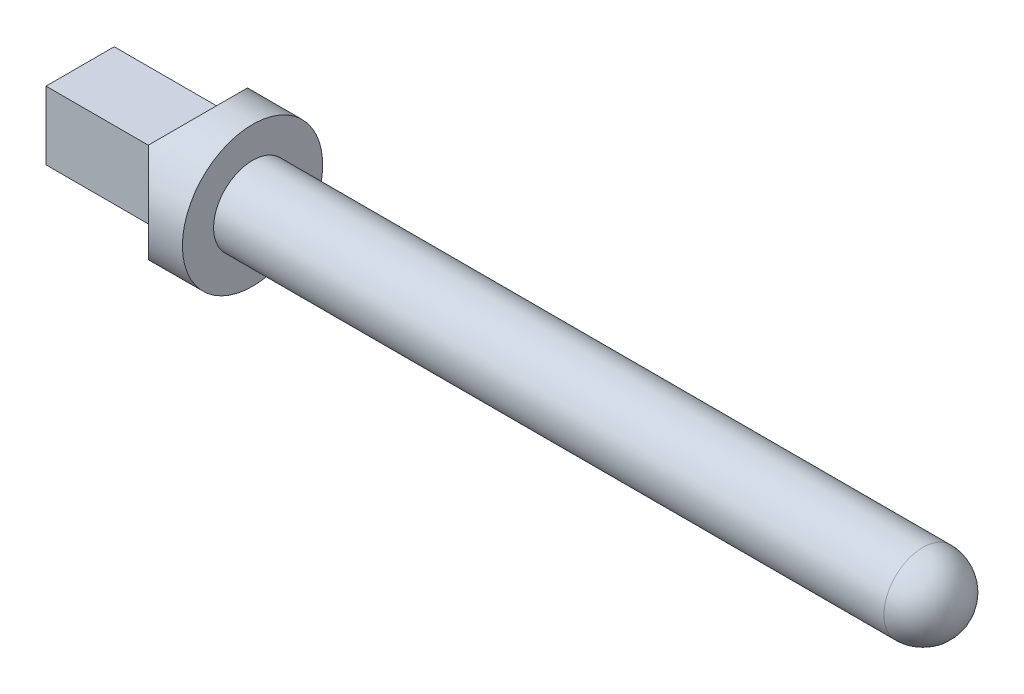
ISO-10303-21;
HEADER;
FILE_DESCRIPTION(('STEP AP214'),'2;1');
FILE_NAME('part.step','',(''),(''),'','','');
FILE_SCHEMA(('AUTOMOTIVE_DESIGN { 1 0 10303 214 1 1 1 1 }'));
ENDSEC;
DATA;
#1=APPLICATION_CONTEXT('core data for automotive mechanical design processes');
#2=APPLICATION_PROTOCOL_DEFINITION('international standard','automotive_design',2000,#1);
#3=PRODUCT_CONTEXT('',#1,'mechanical');
#4=PRODUCT('Part','Part','',(#3));
#5=PRODUCT_RELATED_PRODUCT_CATEGORY('part','',(#4));
#6=PRODUCT_DEFINITION_FORMATION('','',#4);
#7=PRODUCT_DEFINITION_CONTEXT('part definition',#1,'design');
#8=PRODUCT_DEFINITION('design','',#6,#7);
#9=PRODUCT_DEFINITION_SHAPE('','',#8);
#10=(LENGTH_UNIT() NAMED_UNIT(*) SI_UNIT(.MILLI.,.METRE.));
#11=(NAMED_UNIT(*) PLANE_ANGLE_UNIT() SI_UNIT($,.RADIAN.));
#12=(NAMED_UNIT(*) SI_UNIT($,.STERADIAN.) SOLID_ANGLE_UNIT());
#13=UNCERTAINTY_MEASURE_WITH_UNIT(LENGTH_MEASURE(1.E-05),#10,'distance_accuracy_value','');
#14=(GEOMETRIC_REPRESENTATION_CONTEXT(3) GLOBAL_UNCERTAINTY_ASSIGNED_CONTEXT((#13)) GLOBAL_UNIT_ASSIGNED_CONTEXT((#10,
#11,#12)) REPRESENTATION_CONTEXT('',''));
#15=CARTESIAN_POINT('',(0.,0.,0.));
#16=DIRECTION('',(0.,0.,1.));
#17=DIRECTION('',(1.,0.,0.));
#18=AXIS2_PLACEMENT_3D('',#15,#16,#17);
#19=CARTESIAN_POINT('',(-1.524,0.4445,-0.4445));
#20=DIRECTION('',(-1.,0.,0.));
#21=DIRECTION('',(0.,0.,1.));
#22=AXIS2_PLACEMENT_3D('',#19,#20,#21);
#23=PLANE('',#22);
#24=DIRECTION('',(0.,0.,1.));
#25=VECTOR('',#24,1.);
#26=CARTESIAN_POINT('',(-1.524,-0.254,-0.4445));
#27=LINE('',#26,#25);
#28=CARTESIAN_POINT('',(-1.524,-0.254,0.254000000000001));
#29=VERTEX_POINT('',#28);
#30=CARTESIAN_POINT('',(-1.524,-0.254,-0.254));
#31=VERTEX_POINT('',#30);
#32=EDGE_CURVE('E205',#29,#31,#27,.F.);
#33=ORIENTED_EDGE('',*,*,#32,.F.);
#34=DIRECTION('',(0.,1.,0.));
#35=VECTOR('',#34,1.);
#36=CARTESIAN_POINT('',(-1.524,0.4445,0.254));
#37=LINE('',#36,#35);
#38=CARTESIAN_POINT('',(-1.524,0.254,0.254));
#39=VERTEX_POINT('',#38);
#40=EDGE_CURVE('E179',#39,#29,#37,.F.);
#41=ORIENTED_EDGE('',*,*,#40,.F.);
#42=DIRECTION('',(0.,0.,1.));
#43=VECTOR('',#42,1.);
#44=CARTESIAN_POINT('',(-1.524,0.254,-0.4445));
#45=LINE('',#44,#43);
#46=CARTESIAN_POINT('',(-1.524,0.254,-0.254));
#47=VERTEX_POINT('',#46);
#48=EDGE_CURVE('E185',#47,#39,#45,.T.);
#49=ORIENTED_EDGE('',*,*,#48,.F.);
#50=DIRECTION('',(0.,1.,0.));
#51=VECTOR('',#50,1.);
#52=CARTESIAN_POINT('',(-1.524,0.4445,-0.254));
#53=LINE('',#52,#51);
#54=EDGE_CURVE('E199',#31,#47,#53,.T.);
#55=ORIENTED_EDGE('',*,*,#54,.F.);
#56=EDGE_LOOP('',(#33,#41,#49,#55));
#57=FACE_BOUND('',#56,.T.);
#58=ADVANCED_FACE('F17',(#57),#23,.T.);
#59=CARTESIAN_POINT('',(-1.524,-0.254,-0.4445));
#60=DIRECTION('',(-0.707106781186548,-0.707106781186548,0.));
#61=DIRECTION('',(0.707106781186548,-0.707106781186548,0.));
#62=AXIS2_PLACEMENT_3D('',#59,#60,#61);
#63=PLANE('',#62);
#64=DIRECTION('',(-0.577350269189626,0.577350269189626,0.577350269189625));
#65=VECTOR('',#64,1.);
#66=CARTESIAN_POINT('',(-1.3335,-0.4445,-0.444499999999999));
#67=LINE('',#66,#65);
#68=CARTESIAN_POINT('',(-1.3335,-0.4445,-0.444499999999999));
#69=VERTEX_POINT('',#68);
#70=EDGE_CURVE('E202',#69,#31,#67,.T.);
#71=ORIENTED_EDGE('',*,*,#70,.F.);
#72=DIRECTION('',(0.,0.,1.));
#73=VECTOR('',#72,1.);
#74=CARTESIAN_POINT('',(-1.3335,-0.4445,-0.4445));
#75=LINE('',#74,#73);
#76=CARTESIAN_POINT('',(-1.3335,-0.4445,0.4445));
#77=VERTEX_POINT('',#76);
#78=EDGE_CURVE('E188',#69,#77,#75,.T.);
#79=ORIENTED_EDGE('',*,*,#78,.T.);
#80=DIRECTION('',(0.577350269189625,-0.577350269189626,0.577350269189626));
#81=VECTOR('',#80,1.);
#82=CARTESIAN_POINT('',(-1.524,-0.254,0.254000000000001));
#83=LINE('',#82,#81);
#84=EDGE_CURVE('E180',#29,#77,#83,.T.);
#85=ORIENTED_EDGE('',*,*,#84,.F.);
#86=ORIENTED_EDGE('',*,*,#32,.T.);
#87=EDGE_LOOP('',(#71,#79,#85,#86));
#88=FACE_BOUND('',#87,.T.);
#89=ADVANCED_FACE('F280',(#88),#63,.T.);
#90=CARTESIAN_POINT('',(-1.524,0.4445,-0.254));
#91=DIRECTION('',(-0.707106781186548,0.,-0.707106781186548));
#92=DIRECTION('',(-0.707106781186548,0.,0.707106781186548));
#93=AXIS2_PLACEMENT_3D('',#90,#91,#92);
#94=PLANE('',#93);
#95=ORIENTED_EDGE('',*,*,#70,.T.);
#96=ORIENTED_EDGE('',*,*,#54,.T.);
#97=DIRECTION('',(-0.577350269189626,-0.577350269189625,0.577350269189626));
#98=VECTOR('',#97,1.);
#99=CARTESIAN_POINT('',(-1.3335,0.4445,-0.4445));
#100=LINE('',#99,#98);
#101=CARTESIAN_POINT('',(-1.3335,0.444499999999999,-0.4445));
#102=VERTEX_POINT('',#101);
#103=EDGE_CURVE('E196',#102,#47,#100,.T.);
#104=ORIENTED_EDGE('',*,*,#103,.F.);
#105=DIRECTION('',(0.,-1.,0.));
#106=VECTOR('',#105,1.);
#107=CARTESIAN_POINT('',(-1.3335,0.4445,-0.4445));
#108=LINE('',#107,#106);
#109=EDGE_CURVE('E165',#102,#69,#108,.T.);
#110=ORIENTED_EDGE('',*,*,#109,.T.);
#111=EDGE_LOOP('',(#95,#96,#104,#110));
#112=FACE_BOUND('',#111,.T.);
#113=ADVANCED_FACE('F277',(#112),#94,.T.);
#114=CARTESIAN_POINT('',(-1.524,0.254,-0.4445));
#115=DIRECTION('',(-0.707106781186548,0.707106781186548,0.));
#116=DIRECTION('',(-0.707106781186548,-0.707106781186548,0.));
#117=AXIS2_PLACEMENT_3D('',#114,#115,#116);
#118=PLANE('',#117);
#119=ORIENTED_EDGE('',*,*,#103,.T.);
#120=ORIENTED_EDGE('',*,*,#48,.T.);
#121=DIRECTION('',(-0.577350269189626,-0.577350269189626,-0.577350269189625));
#122=VECTOR('',#121,1.);
#123=CARTESIAN_POINT('',(-1.3335,0.4445,0.4445));
#124=LINE('',#123,#122);
#125=CARTESIAN_POINT('',(-1.3335,0.4445,0.444499999999999));
#126=VERTEX_POINT('',#125);
#127=EDGE_CURVE('E176',#126,#39,#124,.T.);
#128=ORIENTED_EDGE('',*,*,#127,.F.);
#129=DIRECTION('',(0.,0.,-1.));
#130=VECTOR('',#129,1.);
#131=CARTESIAN_POINT('',(-1.3335,0.4445,0.4445));
#132=LINE('',#131,#130);
#133=EDGE_CURVE('E160',#126,#102,#132,.T.);
#134=ORIENTED_EDGE('',*,*,#133,.T.);
#135=EDGE_LOOP('',(#119,#120,#128,#134));
#136=FACE_BOUND('',#135,.T.);
#137=ADVANCED_FACE('F273',(#136),#118,.T.);
#138=CARTESIAN_POINT('',(-1.524,0.4445,0.254));
#139=DIRECTION('',(-0.707106781186548,0.,0.707106781186548));
#140=DIRECTION('',(0.707106781186548,0.,0.707106781186548));
#141=AXIS2_PLACEMENT_3D('',#138,#139,#140);
#142=PLANE('',#141);
#143=ORIENTED_EDGE('',*,*,#127,.T.);
#144=ORIENTED_EDGE('',*,*,#40,.T.);
#145=ORIENTED_EDGE('',*,*,#84,.T.);
#146=DIRECTION('',(0.,1.,0.));
#147=VECTOR('',#146,1.);
#148=CARTESIAN_POINT('',(-1.3335,-0.4445,0.4445));
#149=LINE('',#148,#147);
#150=EDGE_CURVE('E143',#77,#126,#149,.T.);
#151=ORIENTED_EDGE('',*,*,#150,.T.);
#152=EDGE_LOOP('',(#143,#144,#145,#151));
#153=FACE_BOUND('',#152,.T.);
#154=ADVANCED_FACE('F269',(#153),#142,.T.);
#155=CARTESIAN_POINT('',(-1.524,-0.4445,-0.4445));
#156=DIRECTION('',(0.,1.,0.));
#157=DIRECTION('',(0.,0.,1.));
#158=AXIS2_PLACEMENT_3D('',#155,#156,#157);
#159=PLANE('',#158);
#160=ORIENTED_EDGE('',*,*,#78,.F.);
#161=DIRECTION('',(1.,0.,0.));
#162=VECTOR('',#161,1.);
#163=CARTESIAN_POINT('',(-1.524,-0.4445,-0.444499999999998));
#164=LINE('',#163,#162);
#165=CARTESIAN_POINT('',(0.,-0.4445,-0.4445));
#166=VERTEX_POINT('',#165);
#167=EDGE_CURVE('E163',#69,#166,#164,.T.);
#168=ORIENTED_EDGE('',*,*,#167,.T.);
#169=DIRECTION('',(0.,0.,1.));
#170=VECTOR('',#169,1.);
#171=CARTESIAN_POINT('',(0.,-0.4445,1.016));
#172=LINE('',#171,#170);
#173=CARTESIAN_POINT('',(0.,-0.444500000000001,0.444500000000004));
#174=VERTEX_POINT('',#173);
#175=EDGE_CURVE('E142',#166,#174,#172,.T.);
#176=ORIENTED_EDGE('',*,*,#175,.T.);
#177=DIRECTION('',(1.,0.,0.));
#178=VECTOR('',#177,1.);
#179=CARTESIAN_POINT('',(-1.524,-0.4445,0.4445));
#180=LINE('',#179,#178);
#181=EDGE_CURVE('E146',#174,#77,#180,.F.);
#182=ORIENTED_EDGE('',*,*,#181,.T.);
#183=EDGE_LOOP('',(#160,#168,#176,#182));
#184=FACE_BOUND('',#183,.T.);
#185=ADVANCED_FACE('F265',(#184),#159,.F.);
#186=CARTESIAN_POINT('',(-1.524,0.4445,-0.4445));
#187=DIRECTION('',(0.,0.,1.));
#188=DIRECTION('',(0.,-1.,0.));
#189=AXIS2_PLACEMENT_3D('',#186,#187,#188);
#190=PLANE('',#189);
#191=ORIENTED_EDGE('',*,*,#109,.F.);
#192=DIRECTION('',(1.,0.,0.));
#193=VECTOR('',#192,1.);
#194=CARTESIAN_POINT('',(-1.524,0.444499999999998,-0.4445));
#195=LINE('',#194,#193);
#196=CARTESIAN_POINT('',(0.,0.4445,-0.444500000000001));
#197=VERTEX_POINT('',#196);
#198=EDGE_CURVE('E149',#102,#197,#195,.T.);
#199=ORIENTED_EDGE('',*,*,#198,.T.);
#200=DIRECTION('',(0.,1.,0.));
#201=VECTOR('',#200,1.);
#202=CARTESIAN_POINT('',(0.,-1.016,-0.4445));
#203=LINE('',#202,#201);
#204=EDGE_CURVE('E131',#197,#166,#203,.F.);
#205=ORIENTED_EDGE('',*,*,#204,.T.);
#206=ORIENTED_EDGE('',*,*,#167,.F.);
#207=EDGE_LOOP('',(#191,#199,#205,#206));
#208=FACE_BOUND('',#207,.T.);
#209=ADVANCED_FACE('F261',(#208),#190,.F.);
#210=CARTESIAN_POINT('',(-1.524,0.4445,0.4445));
#211=DIRECTION('',(0.,-1.,0.));
#212=DIRECTION('',(0.,0.,-1.));
#213=AXIS2_PLACEMENT_3D('',#210,#211,#212);
#214=PLANE('',#213);
#215=ORIENTED_EDGE('',*,*,#133,.F.);
#216=DIRECTION('',(1.,0.,0.));
#217=VECTOR('',#216,1.);
#218=CARTESIAN_POINT('',(-1.524,0.4445,0.444499999999998));
#219=LINE('',#218,#217);
#220=CARTESIAN_POINT('',(0.,0.4445,0.444500000000002));
#221=VERTEX_POINT('',#220);
#222=EDGE_CURVE('E140',#126,#221,#219,.T.);
#223=ORIENTED_EDGE('',*,*,#222,.T.);
#224=DIRECTION('',(0.,0.,1.));
#225=VECTOR('',#224,1.);
#226=CARTESIAN_POINT('',(0.,0.4445,-1.016));
#227=LINE('',#226,#225);
#228=EDGE_CURVE('E127',#221,#197,#227,.F.);
#229=ORIENTED_EDGE('',*,*,#228,.T.);
#230=ORIENTED_EDGE('',*,*,#198,.F.);
#231=EDGE_LOOP('',(#215,#223,#229,#230));
#232=FACE_BOUND('',#231,.T.);
#233=ADVANCED_FACE('F257',(#232),#214,.F.);
#234=CARTESIAN_POINT('',(-1.524,-0.4445,0.4445));
#235=DIRECTION('',(0.,0.,-1.));
#236=DIRECTION('',(0.,1.,0.));
#237=AXIS2_PLACEMENT_3D('',#234,#235,#236);
#238=PLANE('',#237);
#239=ORIENTED_EDGE('',*,*,#150,.F.);
#240=ORIENTED_EDGE('',*,*,#181,.F.);
#241=DIRECTION('',(0.,1.,0.));
#242=VECTOR('',#241,1.);
#243=CARTESIAN_POINT('',(0.,1.016,0.4445));
#244=LINE('',#243,#242);
#245=EDGE_CURVE('E106',#174,#221,#244,.T.);
#246=ORIENTED_EDGE('',*,*,#245,.T.);
#247=ORIENTED_EDGE('',*,*,#222,.F.);
#248=EDGE_LOOP('',(#239,#240,#246,#247));
#249=FACE_BOUND('',#248,.T.);
#250=ADVANCED_FACE('F254',(#249),#238,.F.);
#251=CARTESIAN_POINT('',(0.,-0.4445,1.016));
#252=DIRECTION('',(0.707106781186548,0.707106781186548,0.));
#253=DIRECTION('',(-0.707106781186548,0.707106781186548,0.));
#254=AXIS2_PLACEMENT_3D('',#251,#252,#253);
#255=PLANE('',#254);
#256=ORIENTED_EDGE('',*,*,#175,.F.);
#257=DIRECTION('',(0.577350269189627,-0.577350269189626,-0.577350269189625));
#258=VECTOR('',#257,1.);
#259=CARTESIAN_POINT('',(0.,-0.4445,-0.444500000000001));
#260=LINE('',#259,#258);
#261=CARTESIAN_POINT('',(0.202078440716978,-0.646578440716979,-0.64657844071698));
#262=VERTEX_POINT('',#261);
#263=EDGE_CURVE('E113',#166,#262,#260,.T.);
#264=ORIENTED_EDGE('',*,*,#263,.T.);
#265=CARTESIAN_POINT('',(-0.4445,0.,0.));
#266=DIRECTION('',(0.707106781186548,0.707106781186548,0.));
#267=DIRECTION('',(-0.707106781186548,0.707106781186548,0.));
#268=AXIS2_PLACEMENT_3D('',#265,#266,#267);
#269=ELLIPSE('',#268,1.29315688143396,0.9144);
#270=CARTESIAN_POINT('',(0.202078440716968,-0.646578440716973,0.646578440716986));
#271=VERTEX_POINT('',#270);
#272=EDGE_CURVE('E20',#271,#262,#269,.T.);
#273=ORIENTED_EDGE('',*,*,#272,.F.);
#274=DIRECTION('',(-0.577350269189623,0.577350269189626,-0.577350269189629));
#275=VECTOR('',#274,1.);
#276=CARTESIAN_POINT('',(0.202078440716991,-0.646578440717001,0.646578440717009));
#277=LINE('',#276,#275);
#278=EDGE_CURVE('E103',#271,#174,#277,.T.);
#279=ORIENTED_EDGE('',*,*,#278,.T.);
#280=EDGE_LOOP('',(#256,#264,#273,#279));
#281=FACE_BOUND('',#280,.T.);
#282=ADVANCED_FACE('F112',(#281),#255,.F.);
#283=CARTESIAN_POINT('',(0.,-1.016,-0.4445));
#284=DIRECTION('',(0.707106781186548,0.,0.707106781186548));
#285=DIRECTION('',(0.707106781186548,0.,-0.707106781186548));
#286=AXIS2_PLACEMENT_3D('',#283,#284,#285);
#287=PLANE('',#286);
#288=ORIENTED_EDGE('',*,*,#204,.F.);
#289=DIRECTION('',(0.577350269189626,0.577350269189626,-0.577350269189626));
#290=VECTOR('',#289,1.);
#291=CARTESIAN_POINT('',(0.,0.4445,-0.4445));
#292=LINE('',#291,#290);
#293=CARTESIAN_POINT('',(0.202078440716978,0.646578440716978,-0.646578440716981));
#294=VERTEX_POINT('',#293);
#295=EDGE_CURVE('E110',#197,#294,#292,.T.);
#296=ORIENTED_EDGE('',*,*,#295,.T.);
#297=CARTESIAN_POINT('',(-0.444500000000004,0.,0.));
#298=DIRECTION('',(0.707106781186548,0.,0.707106781186548));
#299=DIRECTION('',(-0.707106781186548,0.,0.707106781186548));
#300=AXIS2_PLACEMENT_3D('',#297,#298,#299);
#301=ELLIPSE('',#300,1.29315688143396,0.9144);
#302=EDGE_CURVE('E83',#262,#294,#301,.T.);
#303=ORIENTED_EDGE('',*,*,#302,.F.);
#304=ORIENTED_EDGE('',*,*,#263,.F.);
#305=EDGE_LOOP('',(#288,#296,#303,#304));
#306=FACE_BOUND('',#305,.T.);
#307=ADVANCED_FACE('F249',(#306),#287,.F.);
#308=CARTESIAN_POINT('',(0.,0.4445,-1.016));
#309=DIRECTION('',(0.707106781186548,-0.707106781186548,0.));
#310=DIRECTION('',(0.707106781186548,0.707106781186548,0.));
#311=AXIS2_PLACEMENT_3D('',#308,#309,#310);
#312=PLANE('',#311);
#313=ORIENTED_EDGE('',*,*,#295,.F.);
#314=ORIENTED_EDGE('',*,*,#228,.F.);
#315=DIRECTION('',(0.577350269189629,0.577350269189626,0.577350269189623));
#316=VECTOR('',#315,1.);
#317=CARTESIAN_POINT('',(0.,0.4445,0.444500000000003));
#318=LINE('',#317,#316);
#319=CARTESIAN_POINT('',(0.202078440716977,0.646578440716978,0.646578440716981));
#320=VERTEX_POINT('',#319);
#321=EDGE_CURVE('E114',#221,#320,#318,.T.);
#322=ORIENTED_EDGE('',*,*,#321,.T.);
#323=CARTESIAN_POINT('',(-0.4445,0.,0.));
#324=DIRECTION('',(0.707106781186548,-0.707106781186548,0.));
#325=DIRECTION('',(-0.707106781186548,-0.707106781186548,0.));
#326=AXIS2_PLACEMENT_3D('',#323,#324,#325);
#327=ELLIPSE('',#326,1.29315688143396,0.9144);
#328=EDGE_CURVE('E96',#294,#320,#327,.T.);
#329=ORIENTED_EDGE('',*,*,#328,.F.);
#330=EDGE_LOOP('',(#313,#314,#322,#329));
#331=FACE_BOUND('',#330,.T.);
#332=ADVANCED_FACE('F246',(#331),#312,.F.);
#333=CARTESIAN_POINT('',(0.,1.016,0.4445));
#334=DIRECTION('',(0.707106781186548,0.,-0.707106781186548));
#335=DIRECTION('',(-0.707106781186548,0.,-0.707106781186548));
#336=AXIS2_PLACEMENT_3D('',#333,#334,#335);
#337=PLANE('',#336);
#338=ORIENTED_EDGE('',*,*,#245,.F.);
#339=ORIENTED_EDGE('',*,*,#278,.F.);
#340=CARTESIAN_POINT('',(-0.444500000000011,0.,0.));
#341=DIRECTION('',(0.707106781186548,0.,-0.707106781186548));
#342=DIRECTION('',(-0.707106781186548,0.,-0.707106781186548));
#343=AXIS2_PLACEMENT_3D('',#340,#341,#342);
#344=ELLIPSE('',#343,1.29315688143396,0.9144);
#345=EDGE_CURVE('E90',#320,#271,#344,.T.);
#346=ORIENTED_EDGE('',*,*,#345,.F.);
#347=ORIENTED_EDGE('',*,*,#321,.F.);
#348=EDGE_LOOP('',(#338,#339,#346,#347));
#349=FACE_BOUND('',#348,.T.);
#350=ADVANCED_FACE('F104',(#349),#337,.F.);
#351=CARTESIAN_POINT('',(0.,0.,0.));
#352=DIRECTION('',(-1.,0.,0.));
#353=DIRECTION('',(0.,0.,1.));
#354=AXIS2_PLACEMENT_3D('',#351,#352,#353);
#355=CYLINDRICAL_SURFACE('',#354,0.9144);
#356=ORIENTED_EDGE('',*,*,#272,.T.);
#357=ORIENTED_EDGE('',*,*,#302,.T.);
#358=ORIENTED_EDGE('',*,*,#328,.T.);
#359=ORIENTED_EDGE('',*,*,#345,.T.);
#360=EDGE_LOOP('',(#356,#357,#358,#359));
#361=FACE_BOUND('',#360,.T.);
#362=CARTESIAN_POINT('',(0.9144,0.,0.));
#363=DIRECTION('',(-1.,0.,0.));
#364=DIRECTION('',(0.,0.,1.));
#365=AXIS2_PLACEMENT_3D('',#362,#363,#364);
#366=CIRCLE('',#365,0.9144);
#367=CARTESIAN_POINT('',(0.9144,0.,0.9144));
#368=VERTEX_POINT('',#367);
#369=EDGE_CURVE('E99',#368,#368,#366,.T.);
#370=ORIENTED_EDGE('',*,*,#369,.T.);
#371=EDGE_LOOP('',(#370));
#372=FACE_BOUND('',#371,.T.);
#373=ADVANCED_FACE('F92',(#361,#372),#355,.T.);
#374=CARTESIAN_POINT('',(0.9144,0.9144,0.));
#375=DIRECTION('',(-1.,0.,0.));
#376=DIRECTION('',(0.,0.,1.));
#377=AXIS2_PLACEMENT_3D('',#374,#375,#376);
#378=PLANE('',#377);
#379=CARTESIAN_POINT('',(0.9144,0.,0.));
#380=DIRECTION('',(-1.,0.,0.));
#381=DIRECTION('',(0.,0.,1.));
#382=AXIS2_PLACEMENT_3D('',#379,#380,#381);
#383=CIRCLE('',#382,0.508);
#384=CARTESIAN_POINT('',(0.9144,0.,0.508));
#385=VERTEX_POINT('',#384);
#386=EDGE_CURVE('E26',#385,#385,#383,.F.);
#387=ORIENTED_EDGE('',*,*,#386,.F.);
#388=EDGE_LOOP('',(#387));
#389=FACE_BOUND('',#388,.T.);
#390=ORIENTED_EDGE('',*,*,#369,.F.);
#391=EDGE_LOOP('',(#390));
#392=FACE_BOUND('',#391,.T.);
#393=ADVANCED_FACE('F238',(#389,#392),#378,.F.);
#394=CARTESIAN_POINT('',(9.652,0.,0.));
#395=DIRECTION('',(0.,-1.,0.));
#396=DIRECTION('',(1.,0.,0.));
#397=AXIS2_PLACEMENT_3D('',#394,#395,#396);
#398=SPHERICAL_SURFACE('',#397,0.508);
#399=CARTESIAN_POINT('',(9.652,0.,0.));
#400=DIRECTION('',(-1.,0.,0.));
#401=DIRECTION('',(0.,0.,1.));
#402=AXIS2_PLACEMENT_3D('',#399,#400,#401);
#403=CIRCLE('',#402,0.508);
#404=CARTESIAN_POINT('',(9.652,-0.507999999999994,0.));
#405=VERTEX_POINT('',#404);
#406=CARTESIAN_POINT('',(9.652,0.508000000000003,0.));
#407=VERTEX_POINT('',#406);
#408=EDGE_CURVE('E11',#405,#407,#403,.T.);
#409=ORIENTED_EDGE('',*,*,#408,.F.);
#410=CARTESIAN_POINT('',(9.652,0.,0.));
#411=DIRECTION('',(-1.,0.,0.));
#412=DIRECTION('',(0.,0.,1.));
#413=AXIS2_PLACEMENT_3D('',#410,#411,#412);
#414=CIRCLE('',#413,0.508);
#415=EDGE_CURVE('E34',#407,#405,#414,.T.);
#416=ORIENTED_EDGE('',*,*,#415,.F.);
#417=EDGE_LOOP('',(#409,#416));
#418=FACE_BOUND('',#417,.T.);
#419=ADVANCED_FACE('F233',(#418),#398,.T.);
#420=CARTESIAN_POINT('',(0.,0.,0.));
#421=DIRECTION('',(-1.,0.,0.));
#422=DIRECTION('',(0.,0.,1.));
#423=AXIS2_PLACEMENT_3D('',#420,#421,#422);
#424=CYLINDRICAL_SURFACE('',#423,0.508);
#425=ORIENTED_EDGE('',*,*,#386,.T.);
#426=EDGE_LOOP('',(#425));
#427=FACE_BOUND('',#426,.T.);
#428=ORIENTED_EDGE('',*,*,#415,.T.);
#429=ORIENTED_EDGE('',*,*,#408,.T.);
#430=EDGE_LOOP('',(#428,#429));
#431=FACE_BOUND('',#430,.T.);
#432=ADVANCED_FACE('F237',(#427,#431),#424,.T.);
#433=CLOSED_SHELL('',(#58,#89,#113,#137,#154,#185,#209,#233,#250,#282,#307,#332,#350,#373,#393,
#419,#432));
#434=MANIFOLD_SOLID_BREP('B1',#433);
#435=ADVANCED_BREP_SHAPE_REPRESENTATION('',(#18,#434),#14);
#436=SHAPE_DEFINITION_REPRESENTATION(#9,#435);
ENDSEC;
END-ISO-10303-21;
